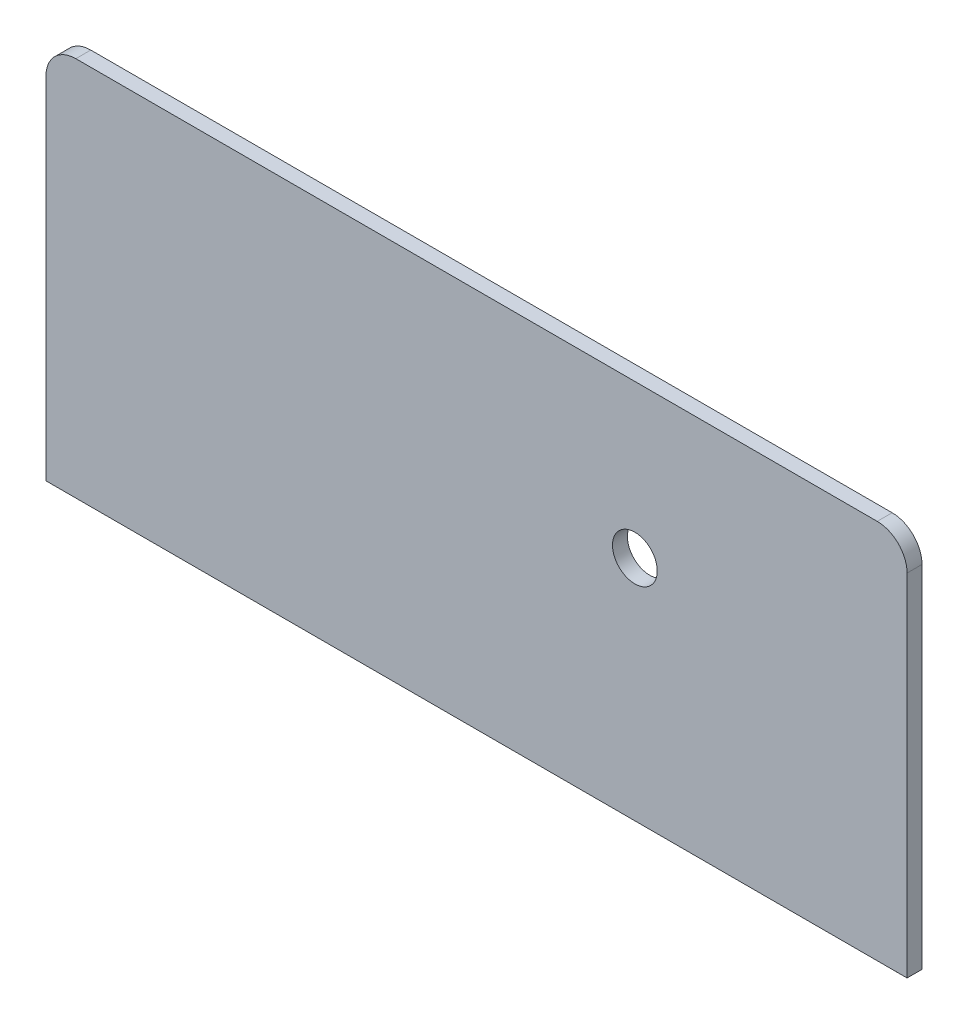
ISO-10303-21;
HEADER;
FILE_DESCRIPTION(('STEP AP214'),'2;1');
FILE_NAME('part.step','',(''),(''),'','','');
FILE_SCHEMA(('AUTOMOTIVE_DESIGN { 1 0 10303 214 1 1 1 1 }'));
ENDSEC;
DATA;
#1=APPLICATION_CONTEXT('core data for automotive mechanical design processes');
#2=APPLICATION_PROTOCOL_DEFINITION('international standard','automotive_design',2000,#1);
#3=PRODUCT_CONTEXT('',#1,'mechanical');
#4=PRODUCT('Part','Part','',(#3));
#5=PRODUCT_RELATED_PRODUCT_CATEGORY('part','',(#4));
#6=PRODUCT_DEFINITION_FORMATION('','',#4);
#7=PRODUCT_DEFINITION_CONTEXT('part definition',#1,'design');
#8=PRODUCT_DEFINITION('design','',#6,#7);
#9=PRODUCT_DEFINITION_SHAPE('','',#8);
#10=(LENGTH_UNIT() NAMED_UNIT(*) SI_UNIT(.MILLI.,.METRE.));
#11=(NAMED_UNIT(*) PLANE_ANGLE_UNIT() SI_UNIT($,.RADIAN.));
#12=(NAMED_UNIT(*) SI_UNIT($,.STERADIAN.) SOLID_ANGLE_UNIT());
#13=UNCERTAINTY_MEASURE_WITH_UNIT(LENGTH_MEASURE(1.E-05),#10,'distance_accuracy_value','');
#14=(GEOMETRIC_REPRESENTATION_CONTEXT(3) GLOBAL_UNCERTAINTY_ASSIGNED_CONTEXT((#13)) GLOBAL_UNIT_ASSIGNED_CONTEXT((#10,
#11,#12)) REPRESENTATION_CONTEXT('',''));
#15=CARTESIAN_POINT('',(0.,0.,0.));
#16=DIRECTION('',(0.,0.,1.));
#17=DIRECTION('',(1.,0.,0.));
#18=AXIS2_PLACEMENT_3D('',#15,#16,#17);
#19=CARTESIAN_POINT('',(0.,64.5000000000024,1.));
#20=DIRECTION('',(0.,1.,0.));
#21=DIRECTION('',(0.,0.,1.));
#22=AXIS2_PLACEMENT_3D('',#19,#20,#21);
#23=PLANE('',#22);
#24=DIRECTION('',(1.,0.,0.));
#25=VECTOR('',#24,1.);
#26=CARTESIAN_POINT('',(0.,64.5000000000024,0.));
#27=LINE('',#26,#25);
#28=CARTESIAN_POINT('',(-47.5999999999998,64.5000000000024,0.));
#29=VERTEX_POINT('',#28);
#30=CARTESIAN_POINT('',(6.10000000000058,64.5000000000024,0.));
#31=VERTEX_POINT('',#30);
#32=EDGE_CURVE('E123',#29,#31,#27,.T.);
#33=ORIENTED_EDGE('',*,*,#32,.F.);
#34=DIRECTION('',(0.,0.,-1.));
#35=VECTOR('',#34,1.);
#36=CARTESIAN_POINT('',(-47.5999999999998,64.5000000000024,1.));
#37=LINE('',#36,#35);
#38=CARTESIAN_POINT('',(-47.5999999999998,64.5000000000024,1.));
#39=VERTEX_POINT('',#38);
#40=EDGE_CURVE('E11',#39,#29,#37,.T.);
#41=ORIENTED_EDGE('',*,*,#40,.F.);
#42=DIRECTION('',(1.,0.,0.));
#43=VECTOR('',#42,1.);
#44=CARTESIAN_POINT('',(0.,64.5000000000024,1.));
#45=LINE('',#44,#43);
#46=CARTESIAN_POINT('',(6.10000000000058,64.5000000000024,1.));
#47=VERTEX_POINT('',#46);
#48=EDGE_CURVE('E174',#39,#47,#45,.T.);
#49=ORIENTED_EDGE('',*,*,#48,.T.);
#50=DIRECTION('',(0.,0.,-1.));
#51=VECTOR('',#50,1.);
#52=CARTESIAN_POINT('',(6.10000000000058,64.5000000000024,1.));
#53=LINE('',#52,#51);
#54=EDGE_CURVE('E83',#47,#31,#53,.T.);
#55=ORIENTED_EDGE('',*,*,#54,.T.);
#56=EDGE_LOOP('',(#33,#41,#49,#55));
#57=FACE_BOUND('',#56,.T.);
#58=ADVANCED_FACE('F38',(#57),#23,.T.);
#59=CARTESIAN_POINT('',(-47.5999999999998,62.4999999999998,1.));
#60=DIRECTION('',(0.,0.,-1.));
#61=DIRECTION('',(-1.,0.,0.));
#62=AXIS2_PLACEMENT_3D('',#59,#60,#61);
#63=CYLINDRICAL_SURFACE('',#62,2.0000000000026);
#64=CARTESIAN_POINT('',(-47.5999999999998,62.4999999999998,0.));
#65=DIRECTION('',(0.,0.,1.));
#66=DIRECTION('',(1.,0.,0.));
#67=AXIS2_PLACEMENT_3D('',#64,#65,#66);
#68=CIRCLE('',#67,2.0000000000026);
#69=CARTESIAN_POINT('',(-49.6000000000024,62.4999999999998,0.));
#70=VERTEX_POINT('',#69);
#71=EDGE_CURVE('E126',#29,#70,#68,.T.);
#72=ORIENTED_EDGE('',*,*,#71,.T.);
#73=DIRECTION('',(0.,0.,-1.));
#74=VECTOR('',#73,1.);
#75=CARTESIAN_POINT('',(-49.6000000000024,62.4999999999998,1.));
#76=LINE('',#75,#74);
#77=CARTESIAN_POINT('',(-49.6000000000024,62.4999999999998,1.));
#78=VERTEX_POINT('',#77);
#79=EDGE_CURVE('E47',#78,#70,#76,.T.);
#80=ORIENTED_EDGE('',*,*,#79,.F.);
#81=CARTESIAN_POINT('',(-47.5999999999998,62.4999999999998,1.));
#82=DIRECTION('',(0.,0.,1.));
#83=DIRECTION('',(1.,0.,0.));
#84=AXIS2_PLACEMENT_3D('',#81,#82,#83);
#85=CIRCLE('',#84,2.0000000000026);
#86=EDGE_CURVE('E176',#39,#78,#85,.T.);
#87=ORIENTED_EDGE('',*,*,#86,.F.);
#88=ORIENTED_EDGE('',*,*,#40,.T.);
#89=EDGE_LOOP('',(#72,#80,#87,#88));
#90=FACE_BOUND('',#89,.T.);
#91=ADVANCED_FACE('F146',(#90),#63,.T.);
#92=CARTESIAN_POINT('',(-49.6000000000024,0.,1.));
#93=DIRECTION('',(1.,0.,0.));
#94=DIRECTION('',(0.,0.,-1.));
#95=AXIS2_PLACEMENT_3D('',#92,#93,#94);
#96=PLANE('',#95);
#97=DIRECTION('',(0.,-1.,0.));
#98=VECTOR('',#97,1.);
#99=CARTESIAN_POINT('',(-49.6000000000024,0.,0.));
#100=LINE('',#99,#98);
#101=CARTESIAN_POINT('',(-49.6000000000024,38.9999999999998,0.));
#102=VERTEX_POINT('',#101);
#103=EDGE_CURVE('E129',#70,#102,#100,.T.);
#104=ORIENTED_EDGE('',*,*,#103,.T.);
#105=DIRECTION('',(0.,0.,-1.));
#106=VECTOR('',#105,1.);
#107=CARTESIAN_POINT('',(-49.6000000000024,38.9999999999998,1.));
#108=LINE('',#107,#106);
#109=CARTESIAN_POINT('',(-49.6000000000024,38.9999999999998,1.));
#110=VERTEX_POINT('',#109);
#111=EDGE_CURVE('E107',#110,#102,#108,.T.);
#112=ORIENTED_EDGE('',*,*,#111,.F.);
#113=DIRECTION('',(0.,-1.,0.));
#114=VECTOR('',#113,1.);
#115=CARTESIAN_POINT('',(-49.6000000000024,0.,1.));
#116=LINE('',#115,#114);
#117=EDGE_CURVE('E112',#78,#110,#116,.T.);
#118=ORIENTED_EDGE('',*,*,#117,.F.);
#119=ORIENTED_EDGE('',*,*,#79,.T.);
#120=EDGE_LOOP('',(#104,#112,#118,#119));
#121=FACE_BOUND('',#120,.T.);
#122=ADVANCED_FACE('F143',(#121),#96,.F.);
#123=CARTESIAN_POINT('',(0.,38.9999999999998,1.));
#124=DIRECTION('',(0.,-1.,0.));
#125=DIRECTION('',(0.,0.,-1.));
#126=AXIS2_PLACEMENT_3D('',#123,#124,#125);
#127=PLANE('',#126);
#128=DIRECTION('',(-1.,0.,0.));
#129=VECTOR('',#128,1.);
#130=CARTESIAN_POINT('',(0.,38.9999999999998,0.));
#131=LINE('',#130,#129);
#132=CARTESIAN_POINT('',(8.1000000000032,38.9999999999998,0.));
#133=VERTEX_POINT('',#132);
#134=EDGE_CURVE('E102',#133,#102,#131,.T.);
#135=ORIENTED_EDGE('',*,*,#134,.F.);
#136=DIRECTION('',(0.,0.,-1.));
#137=VECTOR('',#136,1.);
#138=CARTESIAN_POINT('',(8.1000000000032,38.9999999999998,1.));
#139=LINE('',#138,#137);
#140=CARTESIAN_POINT('',(8.1000000000032,38.9999999999998,1.));
#141=VERTEX_POINT('',#140);
#142=EDGE_CURVE('E97',#141,#133,#139,.T.);
#143=ORIENTED_EDGE('',*,*,#142,.F.);
#144=DIRECTION('',(-1.,0.,0.));
#145=VECTOR('',#144,1.);
#146=CARTESIAN_POINT('',(0.,38.9999999999998,1.));
#147=LINE('',#146,#145);
#148=EDGE_CURVE('E100',#141,#110,#147,.T.);
#149=ORIENTED_EDGE('',*,*,#148,.T.);
#150=ORIENTED_EDGE('',*,*,#111,.T.);
#151=EDGE_LOOP('',(#135,#143,#149,#150));
#152=FACE_BOUND('',#151,.T.);
#153=ADVANCED_FACE('F99',(#152),#127,.T.);
#154=CARTESIAN_POINT('',(8.1000000000032,0.,1.));
#155=DIRECTION('',(1.,0.,0.));
#156=DIRECTION('',(0.,0.,-1.));
#157=AXIS2_PLACEMENT_3D('',#154,#155,#156);
#158=PLANE('',#157);
#159=DIRECTION('',(0.,-1.,0.));
#160=VECTOR('',#159,1.);
#161=CARTESIAN_POINT('',(8.1000000000032,0.,0.));
#162=LINE('',#161,#160);
#163=CARTESIAN_POINT('',(8.1000000000032,62.4999999999998,0.));
#164=VERTEX_POINT('',#163);
#165=EDGE_CURVE('E133',#164,#133,#162,.T.);
#166=ORIENTED_EDGE('',*,*,#165,.F.);
#167=DIRECTION('',(0.,0.,-1.));
#168=VECTOR('',#167,1.);
#169=CARTESIAN_POINT('',(8.1000000000032,62.4999999999998,1.));
#170=LINE('',#169,#168);
#171=CARTESIAN_POINT('',(8.1000000000032,62.4999999999998,1.));
#172=VERTEX_POINT('',#171);
#173=EDGE_CURVE('E76',#172,#164,#170,.T.);
#174=ORIENTED_EDGE('',*,*,#173,.F.);
#175=DIRECTION('',(0.,-1.,0.));
#176=VECTOR('',#175,1.);
#177=CARTESIAN_POINT('',(8.1000000000032,0.,1.));
#178=LINE('',#177,#176);
#179=EDGE_CURVE('E110',#172,#141,#178,.T.);
#180=ORIENTED_EDGE('',*,*,#179,.T.);
#181=ORIENTED_EDGE('',*,*,#142,.T.);
#182=EDGE_LOOP('',(#166,#174,#180,#181));
#183=FACE_BOUND('',#182,.T.);
#184=ADVANCED_FACE('F115',(#183),#158,.T.);
#185=CARTESIAN_POINT('',(-10.1400000000034,54.2500000000002,1.));
#186=DIRECTION('',(0.,0.,-1.));
#187=DIRECTION('',(-1.,0.,0.));
#188=AXIS2_PLACEMENT_3D('',#185,#186,#187);
#189=CYLINDRICAL_SURFACE('',#188,1.5);
#190=CARTESIAN_POINT('',(-10.1400000000034,54.2500000000002,1.));
#191=DIRECTION('',(0.,0.,1.));
#192=DIRECTION('',(1.,0.,0.));
#193=AXIS2_PLACEMENT_3D('',#190,#191,#192);
#194=CIRCLE('',#193,1.5);
#195=CARTESIAN_POINT('',(-8.6400000000034,54.2500000000002,1.));
#196=VERTEX_POINT('',#195);
#197=EDGE_CURVE('E137',#196,#196,#194,.T.);
#198=ORIENTED_EDGE('',*,*,#197,.T.);
#199=EDGE_LOOP('',(#198));
#200=FACE_BOUND('',#199,.T.);
#201=CARTESIAN_POINT('',(-10.1400000000034,54.2500000000002,0.));
#202=DIRECTION('',(0.,0.,1.));
#203=DIRECTION('',(1.,0.,0.));
#204=AXIS2_PLACEMENT_3D('',#201,#202,#203);
#205=CIRCLE('',#204,1.5);
#206=CARTESIAN_POINT('',(-8.6400000000034,54.2500000000002,0.));
#207=VERTEX_POINT('',#206);
#208=EDGE_CURVE('E120',#207,#207,#205,.T.);
#209=ORIENTED_EDGE('',*,*,#208,.F.);
#210=EDGE_LOOP('',(#209));
#211=FACE_BOUND('',#210,.T.);
#212=ADVANCED_FACE('F40',(#200,#211),#189,.F.);
#213=CARTESIAN_POINT('',(6.10000000000058,62.4999999999998,1.));
#214=DIRECTION('',(0.,0.,-1.));
#215=DIRECTION('',(-1.,0.,0.));
#216=AXIS2_PLACEMENT_3D('',#213,#214,#215);
#217=CYLINDRICAL_SURFACE('',#216,2.00000000000261);
#218=CARTESIAN_POINT('',(6.10000000000058,62.4999999999998,0.));
#219=DIRECTION('',(0.,0.,1.));
#220=DIRECTION('',(1.,0.,0.));
#221=AXIS2_PLACEMENT_3D('',#218,#219,#220);
#222=CIRCLE('',#221,2.00000000000261);
#223=EDGE_CURVE('E135',#164,#31,#222,.T.);
#224=ORIENTED_EDGE('',*,*,#223,.T.);
#225=ORIENTED_EDGE('',*,*,#54,.F.);
#226=CARTESIAN_POINT('',(6.10000000000058,62.4999999999998,1.));
#227=DIRECTION('',(0.,0.,1.));
#228=DIRECTION('',(1.,0.,0.));
#229=AXIS2_PLACEMENT_3D('',#226,#227,#228);
#230=CIRCLE('',#229,2.00000000000261);
#231=EDGE_CURVE('E55',#172,#47,#230,.T.);
#232=ORIENTED_EDGE('',*,*,#231,.F.);
#233=ORIENTED_EDGE('',*,*,#173,.T.);
#234=EDGE_LOOP('',(#224,#225,#232,#233));
#235=FACE_BOUND('',#234,.T.);
#236=ADVANCED_FACE('F161',(#235),#217,.T.);
#237=CARTESIAN_POINT('',(0.,0.,1.));
#238=DIRECTION('',(0.,0.,1.));
#239=DIRECTION('',(1.,0.,0.));
#240=AXIS2_PLACEMENT_3D('',#237,#238,#239);
#241=PLANE('',#240);
#242=ORIENTED_EDGE('',*,*,#197,.F.);
#243=EDGE_LOOP('',(#242));
#244=FACE_BOUND('',#243,.T.);
#245=ORIENTED_EDGE('',*,*,#48,.F.);
#246=ORIENTED_EDGE('',*,*,#86,.T.);
#247=ORIENTED_EDGE('',*,*,#117,.T.);
#248=ORIENTED_EDGE('',*,*,#148,.F.);
#249=ORIENTED_EDGE('',*,*,#179,.F.);
#250=ORIENTED_EDGE('',*,*,#231,.T.);
#251=EDGE_LOOP('',(#245,#246,#247,#248,#249,#250));
#252=FACE_BOUND('',#251,.T.);
#253=ADVANCED_FACE('F109',(#244,#252),#241,.T.);
#254=CARTESIAN_POINT('',(0.,0.,0.));
#255=DIRECTION('',(0.,0.,1.));
#256=DIRECTION('',(1.,0.,0.));
#257=AXIS2_PLACEMENT_3D('',#254,#255,#256);
#258=PLANE('',#257);
#259=ORIENTED_EDGE('',*,*,#208,.T.);
#260=EDGE_LOOP('',(#259));
#261=FACE_BOUND('',#260,.T.);
#262=ORIENTED_EDGE('',*,*,#32,.T.);
#263=ORIENTED_EDGE('',*,*,#223,.F.);
#264=ORIENTED_EDGE('',*,*,#165,.T.);
#265=ORIENTED_EDGE('',*,*,#134,.T.);
#266=ORIENTED_EDGE('',*,*,#103,.F.);
#267=ORIENTED_EDGE('',*,*,#71,.F.);
#268=EDGE_LOOP('',(#262,#263,#264,#265,#266,#267));
#269=FACE_BOUND('',#268,.T.);
#270=ADVANCED_FACE('F148',(#261,#269),#258,.F.);
#271=CLOSED_SHELL('',(#58,#91,#122,#153,#184,#212,#236,#253,#270));
#272=MANIFOLD_SOLID_BREP('B2',#271);
#273=ADVANCED_BREP_SHAPE_REPRESENTATION('',(#18,#272),#14);
#274=SHAPE_DEFINITION_REPRESENTATION(#9,#273);
ENDSEC;
END-ISO-10303-21;
